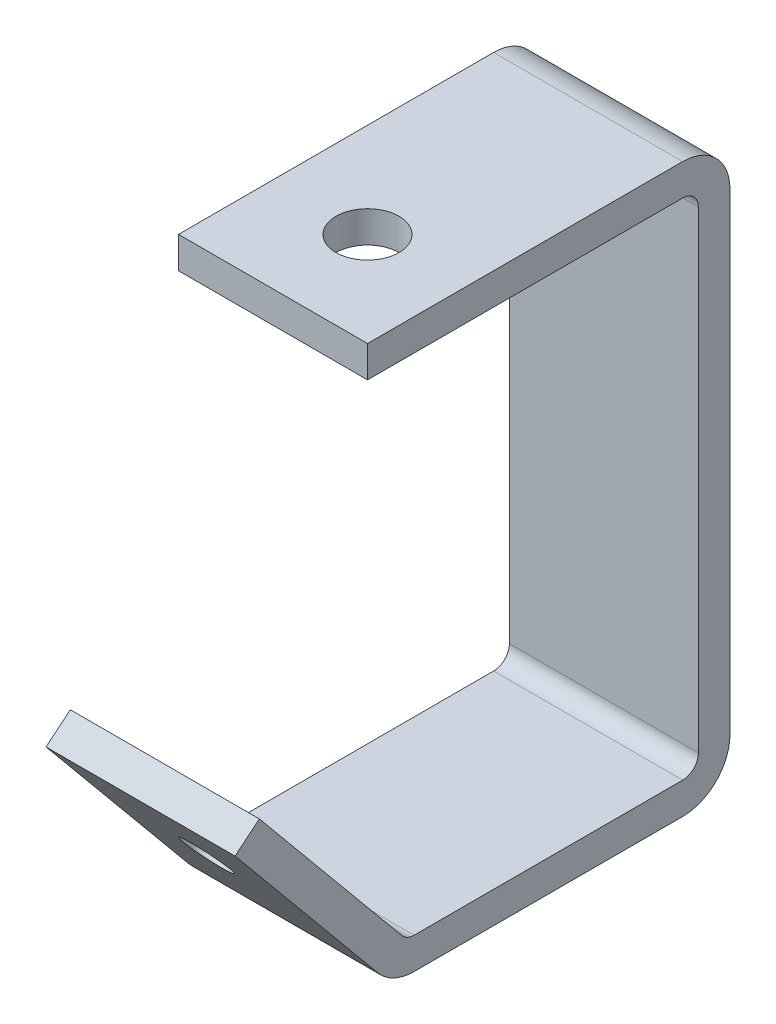
ISO-10303-21;
HEADER;
FILE_DESCRIPTION(('STEP AP214'),'2;1');
FILE_NAME('part.step','',(''),(''),'','','');
FILE_SCHEMA(('AUTOMOTIVE_DESIGN { 1 0 10303 214 1 1 1 1 }'));
ENDSEC;
DATA;
#1=APPLICATION_CONTEXT('core data for automotive mechanical design processes');
#2=APPLICATION_PROTOCOL_DEFINITION('international standard','automotive_design',2000,#1);
#3=PRODUCT_CONTEXT('',#1,'mechanical');
#4=PRODUCT('Part','Part','',(#3));
#5=PRODUCT_RELATED_PRODUCT_CATEGORY('part','',(#4));
#6=PRODUCT_DEFINITION_FORMATION('','',#4);
#7=PRODUCT_DEFINITION_CONTEXT('part definition',#1,'design');
#8=PRODUCT_DEFINITION('design','',#6,#7);
#9=PRODUCT_DEFINITION_SHAPE('','',#8);
#10=(LENGTH_UNIT() NAMED_UNIT(*) SI_UNIT(.MILLI.,.METRE.));
#11=(NAMED_UNIT(*) PLANE_ANGLE_UNIT() SI_UNIT($,.RADIAN.));
#12=(NAMED_UNIT(*) SI_UNIT($,.STERADIAN.) SOLID_ANGLE_UNIT());
#13=UNCERTAINTY_MEASURE_WITH_UNIT(LENGTH_MEASURE(1.E-05),#10,'distance_accuracy_value','');
#14=(GEOMETRIC_REPRESENTATION_CONTEXT(3) GLOBAL_UNCERTAINTY_ASSIGNED_CONTEXT((#13)) GLOBAL_UNIT_ASSIGNED_CONTEXT((#10,
#11,#12)) REPRESENTATION_CONTEXT('',''));
#15=CARTESIAN_POINT('',(0.,0.,0.));
#16=DIRECTION('',(0.,0.,1.));
#17=DIRECTION('',(1.,0.,0.));
#18=AXIS2_PLACEMENT_3D('',#15,#16,#17);
#19=CARTESIAN_POINT('',(38.1,0.,0.));
#20=DIRECTION('',(0.,0.,-1.));
#21=DIRECTION('',(-1.,0.,0.));
#22=AXIS2_PLACEMENT_3D('',#19,#20,#21);
#23=PLANE('',#22);
#24=DIRECTION('',(0.,-1.,0.));
#25=VECTOR('',#24,1.);
#26=CARTESIAN_POINT('',(0.,0.,0.));
#27=LINE('',#26,#25);
#28=CARTESIAN_POINT('',(0.,0.,0.));
#29=VERTEX_POINT('',#28);
#30=CARTESIAN_POINT('',(0.,-6.35,0.));
#31=VERTEX_POINT('',#30);
#32=EDGE_CURVE('E194',#29,#31,#27,.T.);
#33=ORIENTED_EDGE('',*,*,#32,.T.);
#34=DIRECTION('',(-1.,0.,0.));
#35=VECTOR('',#34,1.);
#36=CARTESIAN_POINT('',(38.1,-6.35,0.));
#37=LINE('',#36,#35);
#38=CARTESIAN_POINT('',(38.1,-6.35,0.));
#39=VERTEX_POINT('',#38);
#40=EDGE_CURVE('E11',#39,#31,#37,.T.);
#41=ORIENTED_EDGE('',*,*,#40,.F.);
#42=DIRECTION('',(0.,-1.,0.));
#43=VECTOR('',#42,1.);
#44=CARTESIAN_POINT('',(38.1,0.,0.));
#45=LINE('',#44,#43);
#46=CARTESIAN_POINT('',(38.1,0.,0.));
#47=VERTEX_POINT('',#46);
#48=EDGE_CURVE('E241',#47,#39,#45,.T.);
#49=ORIENTED_EDGE('',*,*,#48,.F.);
#50=DIRECTION('',(-1.,0.,0.));
#51=VECTOR('',#50,1.);
#52=CARTESIAN_POINT('',(38.1,0.,0.));
#53=LINE('',#52,#51);
#54=EDGE_CURVE('E190',#47,#29,#53,.T.);
#55=ORIENTED_EDGE('',*,*,#54,.T.);
#56=EDGE_LOOP('',(#33,#41,#49,#55));
#57=FACE_BOUND('',#56,.T.);
#58=ADVANCED_FACE('F45',(#57),#23,.F.);
#59=CARTESIAN_POINT('',(38.1,-6.35,0.));
#60=DIRECTION('',(0.,1.,0.));
#61=DIRECTION('',(0.,0.,1.));
#62=AXIS2_PLACEMENT_3D('',#59,#60,#61);
#63=PLANE('',#62);
#64=CARTESIAN_POINT('',(19.05,-6.34999999999999,-19.04));
#65=DIRECTION('',(0.,1.,0.));
#66=DIRECTION('',(0.,0.,1.));
#67=AXIS2_PLACEMENT_3D('',#64,#65,#66);
#68=CIRCLE('',#67,6.35);
#69=CARTESIAN_POINT('',(19.05,-6.34999999999999,-12.69));
#70=VERTEX_POINT('',#69);
#71=EDGE_CURVE('E199',#70,#70,#68,.F.);
#72=ORIENTED_EDGE('',*,*,#71,.F.);
#73=EDGE_LOOP('',(#72));
#74=FACE_BOUND('',#73,.T.);
#75=DIRECTION('',(0.,0.,-1.));
#76=VECTOR('',#75,1.);
#77=CARTESIAN_POINT('',(0.,-6.35,0.));
#78=LINE('',#77,#76);
#79=CARTESIAN_POINT('',(0.,-6.35,-63.51));
#80=VERTEX_POINT('',#79);
#81=EDGE_CURVE('E198',#31,#80,#78,.T.);
#82=ORIENTED_EDGE('',*,*,#81,.T.);
#83=DIRECTION('',(-1.,0.,0.));
#84=VECTOR('',#83,1.);
#85=CARTESIAN_POINT('',(38.1,-6.35,-63.51));
#86=LINE('',#85,#84);
#87=CARTESIAN_POINT('',(38.1,-6.35,-63.51));
#88=VERTEX_POINT('',#87);
#89=EDGE_CURVE('E54',#88,#80,#86,.T.);
#90=ORIENTED_EDGE('',*,*,#89,.F.);
#91=DIRECTION('',(0.,0.,-1.));
#92=VECTOR('',#91,1.);
#93=CARTESIAN_POINT('',(38.1,-6.35,0.));
#94=LINE('',#93,#92);
#95=EDGE_CURVE('E129',#39,#88,#94,.T.);
#96=ORIENTED_EDGE('',*,*,#95,.F.);
#97=ORIENTED_EDGE('',*,*,#40,.T.);
#98=EDGE_LOOP('',(#82,#90,#96,#97));
#99=FACE_BOUND('',#98,.T.);
#100=ADVANCED_FACE('F367',(#74,#99),#63,.F.);
#101=CARTESIAN_POINT('',(38.1,-9.53,-63.51));
#102=DIRECTION('',(-1.,0.,0.));
#103=DIRECTION('',(0.,0.,1.));
#104=AXIS2_PLACEMENT_3D('',#101,#102,#103);
#105=CYLINDRICAL_SURFACE('',#104,3.18);
#106=CARTESIAN_POINT('',(0.,-9.53,-63.51));
#107=DIRECTION('',(-1.,0.,0.));
#108=DIRECTION('',(0.,0.,1.));
#109=AXIS2_PLACEMENT_3D('',#106,#107,#108);
#110=CIRCLE('',#109,3.18);
#111=CARTESIAN_POINT('',(0.,-9.53,-66.69));
#112=VERTEX_POINT('',#111);
#113=EDGE_CURVE('E202',#80,#112,#110,.T.);
#114=ORIENTED_EDGE('',*,*,#113,.T.);
#115=DIRECTION('',(-1.,0.,0.));
#116=VECTOR('',#115,1.);
#117=CARTESIAN_POINT('',(38.1,-9.53,-66.69));
#118=LINE('',#117,#116);
#119=CARTESIAN_POINT('',(38.1,-9.53,-66.69));
#120=VERTEX_POINT('',#119);
#121=EDGE_CURVE('E284',#120,#112,#118,.T.);
#122=ORIENTED_EDGE('',*,*,#121,.F.);
#123=CARTESIAN_POINT('',(38.1,-9.53,-63.51));
#124=DIRECTION('',(-1.,0.,0.));
#125=DIRECTION('',(0.,0.,1.));
#126=AXIS2_PLACEMENT_3D('',#123,#124,#125);
#127=CIRCLE('',#126,3.18);
#128=EDGE_CURVE('E294',#88,#120,#127,.T.);
#129=ORIENTED_EDGE('',*,*,#128,.F.);
#130=ORIENTED_EDGE('',*,*,#89,.T.);
#131=EDGE_LOOP('',(#114,#122,#129,#130));
#132=FACE_BOUND('',#131,.T.);
#133=ADVANCED_FACE('F292',(#132),#105,.F.);
#134=CARTESIAN_POINT('',(38.1,-9.53,-66.69));
#135=DIRECTION('',(0.,0.,-1.));
#136=DIRECTION('',(0.,1.,0.));
#137=AXIS2_PLACEMENT_3D('',#134,#135,#136);
#138=PLANE('',#137);
#139=DIRECTION('',(0.,-1.,0.));
#140=VECTOR('',#139,1.);
#141=CARTESIAN_POINT('',(0.,-9.53,-66.69));
#142=LINE('',#141,#140);
#143=CARTESIAN_POINT('',(0.,-104.78,-66.69));
#144=VERTEX_POINT('',#143);
#145=EDGE_CURVE('E205',#112,#144,#142,.T.);
#146=ORIENTED_EDGE('',*,*,#145,.T.);
#147=DIRECTION('',(-1.,0.,0.));
#148=VECTOR('',#147,1.);
#149=CARTESIAN_POINT('',(38.1,-104.78,-66.69));
#150=LINE('',#149,#148);
#151=CARTESIAN_POINT('',(38.1,-104.78,-66.69));
#152=VERTEX_POINT('',#151);
#153=EDGE_CURVE('E280',#152,#144,#150,.T.);
#154=ORIENTED_EDGE('',*,*,#153,.F.);
#155=DIRECTION('',(0.,-1.,0.));
#156=VECTOR('',#155,1.);
#157=CARTESIAN_POINT('',(38.1,-9.53,-66.69));
#158=LINE('',#157,#156);
#159=EDGE_CURVE('E313',#120,#152,#158,.T.);
#160=ORIENTED_EDGE('',*,*,#159,.F.);
#161=ORIENTED_EDGE('',*,*,#121,.T.);
#162=EDGE_LOOP('',(#146,#154,#160,#161));
#163=FACE_BOUND('',#162,.T.);
#164=ADVANCED_FACE('F303',(#163),#138,.F.);
#165=CARTESIAN_POINT('',(38.1,-104.78,-63.51));
#166=DIRECTION('',(-1.,0.,0.));
#167=DIRECTION('',(0.,0.,1.));
#168=AXIS2_PLACEMENT_3D('',#165,#166,#167);
#169=CYLINDRICAL_SURFACE('',#168,3.18000000000001);
#170=CARTESIAN_POINT('',(0.,-104.78,-63.51));
#171=DIRECTION('',(-1.,0.,0.));
#172=DIRECTION('',(0.,0.,1.));
#173=AXIS2_PLACEMENT_3D('',#170,#171,#172);
#174=CIRCLE('',#173,3.18000000000001);
#175=CARTESIAN_POINT('',(0.,-107.96,-63.51));
#176=VERTEX_POINT('',#175);
#177=EDGE_CURVE('E208',#144,#176,#174,.T.);
#178=ORIENTED_EDGE('',*,*,#177,.T.);
#179=DIRECTION('',(-1.,0.,0.));
#180=VECTOR('',#179,1.);
#181=CARTESIAN_POINT('',(38.1,-107.96,-63.51));
#182=LINE('',#181,#180);
#183=CARTESIAN_POINT('',(38.1,-107.96,-63.51));
#184=VERTEX_POINT('',#183);
#185=EDGE_CURVE('E276',#184,#176,#182,.T.);
#186=ORIENTED_EDGE('',*,*,#185,.F.);
#187=CARTESIAN_POINT('',(38.1,-104.78,-63.51));
#188=DIRECTION('',(-1.,0.,0.));
#189=DIRECTION('',(0.,0.,1.));
#190=AXIS2_PLACEMENT_3D('',#187,#188,#189);
#191=CIRCLE('',#190,3.18000000000001);
#192=EDGE_CURVE('E309',#152,#184,#191,.T.);
#193=ORIENTED_EDGE('',*,*,#192,.F.);
#194=ORIENTED_EDGE('',*,*,#153,.T.);
#195=EDGE_LOOP('',(#178,#186,#193,#194));
#196=FACE_BOUND('',#195,.T.);
#197=ADVANCED_FACE('F307',(#196),#169,.F.);
#198=CARTESIAN_POINT('',(38.1,-107.96,-63.51));
#199=DIRECTION('',(0.,-1.,0.));
#200=DIRECTION('',(0.,0.,-1.));
#201=AXIS2_PLACEMENT_3D('',#198,#199,#200);
#202=PLANE('',#201);
#203=DIRECTION('',(0.,0.,1.));
#204=VECTOR('',#203,1.);
#205=CARTESIAN_POINT('',(0.,-107.96,-63.51));
#206=LINE('',#205,#204);
#207=CARTESIAN_POINT('',(0.,-107.96,-9.39000000000001));
#208=VERTEX_POINT('',#207);
#209=EDGE_CURVE('E211',#176,#208,#206,.T.);
#210=ORIENTED_EDGE('',*,*,#209,.T.);
#211=DIRECTION('',(-1.,0.,0.));
#212=VECTOR('',#211,1.);
#213=CARTESIAN_POINT('',(38.1,-107.96,-9.39000000000001));
#214=LINE('',#213,#212);
#215=CARTESIAN_POINT('',(38.1,-107.96,-9.39000000000001));
#216=VERTEX_POINT('',#215);
#217=EDGE_CURVE('E272',#216,#208,#214,.T.);
#218=ORIENTED_EDGE('',*,*,#217,.F.);
#219=DIRECTION('',(0.,0.,1.));
#220=VECTOR('',#219,1.);
#221=CARTESIAN_POINT('',(38.1,-107.96,-63.51));
#222=LINE('',#221,#220);
#223=EDGE_CURVE('E312',#184,#216,#222,.T.);
#224=ORIENTED_EDGE('',*,*,#223,.F.);
#225=ORIENTED_EDGE('',*,*,#185,.T.);
#226=EDGE_LOOP('',(#210,#218,#224,#225));
#227=FACE_BOUND('',#226,.T.);
#228=ADVANCED_FACE('F382',(#227),#202,.F.);
#229=CARTESIAN_POINT('',(38.1,-104.78,-9.39000000000001));
#230=DIRECTION('',(-1.,0.,0.));
#231=DIRECTION('',(0.,0.,1.));
#232=AXIS2_PLACEMENT_3D('',#229,#230,#231);
#233=CYLINDRICAL_SURFACE('',#232,3.18);
#234=CARTESIAN_POINT('',(0.,-104.78,-9.39000000000001));
#235=DIRECTION('',(-1.,0.,0.));
#236=DIRECTION('',(0.,0.,1.));
#237=AXIS2_PLACEMENT_3D('',#234,#235,#236);
#238=CIRCLE('',#237,3.18);
#239=CARTESIAN_POINT('',(0.,-106.807009423942,-6.93976882820203));
#240=VERTEX_POINT('',#239);
#241=EDGE_CURVE('E214',#208,#240,#238,.T.);
#242=ORIENTED_EDGE('',*,*,#241,.T.);
#243=DIRECTION('',(-1.,0.,0.));
#244=VECTOR('',#243,1.);
#245=CARTESIAN_POINT('',(38.1,-106.807009423942,-6.93976882820203));
#246=LINE('',#245,#244);
#247=CARTESIAN_POINT('',(38.1,-106.807009423942,-6.93976882820203));
#248=VERTEX_POINT('',#247);
#249=EDGE_CURVE('E268',#248,#240,#246,.T.);
#250=ORIENTED_EDGE('',*,*,#249,.F.);
#251=CARTESIAN_POINT('',(38.1,-104.78,-9.39000000000001));
#252=DIRECTION('',(-1.,0.,0.));
#253=DIRECTION('',(0.,0.,1.));
#254=AXIS2_PLACEMENT_3D('',#251,#252,#253);
#255=CIRCLE('',#254,3.18);
#256=EDGE_CURVE('E317',#216,#248,#255,.T.);
#257=ORIENTED_EDGE('',*,*,#256,.F.);
#258=ORIENTED_EDGE('',*,*,#217,.T.);
#259=EDGE_LOOP('',(#242,#250,#257,#258));
#260=FACE_BOUND('',#259,.T.);
#261=ADVANCED_FACE('F385',(#260),#233,.F.);
#262=CARTESIAN_POINT('',(38.1,-106.807009423942,-6.93976882820203));
#263=DIRECTION('',(0.,-0.637424347151558,0.770512947106283));
#264=DIRECTION('',(0.,-0.770512947106283,-0.637424347151558));
#265=AXIS2_PLACEMENT_3D('',#262,#263,#264);
#266=PLANE('',#265);
#267=CARTESIAN_POINT('',(19.05,-88.0989550682014,8.53689432063778));
#268=DIRECTION('',(0.,-0.637424347151558,0.770512947106283));
#269=DIRECTION('',(0.,-0.770512947106283,-0.637424347151558));
#270=AXIS2_PLACEMENT_3D('',#267,#268,#269);
#271=CIRCLE('',#270,4.765);
#272=CARTESIAN_POINT('',(19.05,-91.7704492611628,5.49956730646061));
#273=VERTEX_POINT('',#272);
#274=EDGE_CURVE('E538',#273,#273,#271,.F.);
#275=ORIENTED_EDGE('',*,*,#274,.F.);
#276=EDGE_LOOP('',(#275));
#277=FACE_BOUND('',#276,.T.);
#278=DIRECTION('',(0.,0.770512947106283,0.637424347151558));
#279=VECTOR('',#278,1.);
#280=CARTESIAN_POINT('',(0.,-106.807009423942,-6.93976882820203));
#281=LINE('',#280,#279);
#282=CARTESIAN_POINT('',(0.,-72.0645806389196,21.8016949848617));
#283=VERTEX_POINT('',#282);
#284=EDGE_CURVE('E217',#240,#283,#281,.T.);
#285=ORIENTED_EDGE('',*,*,#284,.T.);
#286=DIRECTION('',(-1.,0.,0.));
#287=VECTOR('',#286,1.);
#288=CARTESIAN_POINT('',(38.1,-72.0645806389196,21.8016949848617));
#289=LINE('',#288,#287);
#290=CARTESIAN_POINT('',(38.1,-72.0645806389196,21.8016949848617));
#291=VERTEX_POINT('',#290);
#292=EDGE_CURVE('E264',#291,#283,#289,.T.);
#293=ORIENTED_EDGE('',*,*,#292,.F.);
#294=DIRECTION('',(0.,0.770512947106283,0.637424347151558));
#295=VECTOR('',#294,1.);
#296=CARTESIAN_POINT('',(38.1,-106.807009423942,-6.93976882820203));
#297=LINE('',#296,#295);
#298=EDGE_CURVE('E324',#248,#291,#297,.T.);
#299=ORIENTED_EDGE('',*,*,#298,.F.);
#300=ORIENTED_EDGE('',*,*,#249,.T.);
#301=EDGE_LOOP('',(#285,#293,#299,#300));
#302=FACE_BOUND('',#301,.T.);
#303=ADVANCED_FACE('F389',(#277,#302),#266,.F.);
#304=CARTESIAN_POINT('',(38.1,-76.112225243332,26.6944521989866));
#305=DIRECTION('',(0.,-0.770512947106282,-0.637424347151559));
#306=DIRECTION('',(0.,0.637424347151559,-0.770512947106282));
#307=AXIS2_PLACEMENT_3D('',#304,#305,#306);
#308=PLANE('',#307);
#309=DIRECTION('',(0.,-0.637424347151559,0.770512947106283));
#310=VECTOR('',#309,1.);
#311=CARTESIAN_POINT('',(0.,-76.112225243332,26.6944521989866));
#312=LINE('',#311,#310);
#313=CARTESIAN_POINT('',(0.,-76.112225243332,26.6944521989866));
#314=VERTEX_POINT('',#313);
#315=EDGE_CURVE('E220',#283,#314,#312,.T.);
#316=ORIENTED_EDGE('',*,*,#315,.T.);
#317=DIRECTION('',(-1.,0.,0.));
#318=VECTOR('',#317,1.);
#319=CARTESIAN_POINT('',(38.1,-76.112225243332,26.6944521989866));
#320=LINE('',#319,#318);
#321=CARTESIAN_POINT('',(38.1,-76.112225243332,26.6944521989866));
#322=VERTEX_POINT('',#321);
#323=EDGE_CURVE('E260',#322,#314,#320,.T.);
#324=ORIENTED_EDGE('',*,*,#323,.F.);
#325=DIRECTION('',(0.,-0.637424347151559,0.770512947106283));
#326=VECTOR('',#325,1.);
#327=CARTESIAN_POINT('',(38.1,-76.112225243332,26.6944521989866));
#328=LINE('',#327,#326);
#329=EDGE_CURVE('E327',#291,#322,#328,.T.);
#330=ORIENTED_EDGE('',*,*,#329,.F.);
#331=ORIENTED_EDGE('',*,*,#292,.T.);
#332=EDGE_LOOP('',(#316,#324,#330,#331));
#333=FACE_BOUND('',#332,.T.);
#334=ADVANCED_FACE('F393',(#333),#308,.F.);
#335=CARTESIAN_POINT('',(38.1,-110.854654028354,-2.04701161407714));
#336=DIRECTION('',(0.,0.637424347151558,-0.770512947106283));
#337=DIRECTION('',(0.,0.770512947106283,0.637424347151558));
#338=AXIS2_PLACEMENT_3D('',#335,#336,#337);
#339=PLANE('',#338);
#340=CARTESIAN_POINT('',(19.05,-92.1465996726138,13.4296515347627));
#341=DIRECTION('',(0.,-0.637424347151558,0.770512947106283));
#342=DIRECTION('',(0.,-0.770512947106283,-0.637424347151558));
#343=AXIS2_PLACEMENT_3D('',#340,#341,#342);
#344=CIRCLE('',#343,4.765);
#345=CARTESIAN_POINT('',(19.05,-95.8180938655752,10.3923245205855));
#346=VERTEX_POINT('',#345);
#347=EDGE_CURVE('E535',#346,#346,#344,.T.);
#348=ORIENTED_EDGE('',*,*,#347,.F.);
#349=EDGE_LOOP('',(#348));
#350=FACE_BOUND('',#349,.T.);
#351=DIRECTION('',(0.,-0.770512947106283,-0.637424347151558));
#352=VECTOR('',#351,1.);
#353=CARTESIAN_POINT('',(0.,-110.854654028354,-2.04701161407714));
#354=LINE('',#353,#352);
#355=CARTESIAN_POINT('',(0.,-110.854654028354,-2.04701161407715));
#356=VERTEX_POINT('',#355);
#357=EDGE_CURVE('E223',#314,#356,#354,.T.);
#358=ORIENTED_EDGE('',*,*,#357,.T.);
#359=DIRECTION('',(-1.,0.,0.));
#360=VECTOR('',#359,1.);
#361=CARTESIAN_POINT('',(38.1,-110.854654028354,-2.04701161407715));
#362=LINE('',#361,#360);
#363=CARTESIAN_POINT('',(38.1,-110.854654028354,-2.04701161407715));
#364=VERTEX_POINT('',#363);
#365=EDGE_CURVE('E256',#364,#356,#362,.T.);
#366=ORIENTED_EDGE('',*,*,#365,.F.);
#367=DIRECTION('',(0.,-0.770512947106283,-0.637424347151558));
#368=VECTOR('',#367,1.);
#369=CARTESIAN_POINT('',(38.1,-110.854654028354,-2.04701161407714));
#370=LINE('',#369,#368);
#371=EDGE_CURVE('E330',#322,#364,#370,.T.);
#372=ORIENTED_EDGE('',*,*,#371,.F.);
#373=ORIENTED_EDGE('',*,*,#323,.T.);
#374=EDGE_LOOP('',(#358,#366,#372,#373));
#375=FACE_BOUND('',#374,.T.);
#376=ADVANCED_FACE('F397',(#350,#375),#339,.F.);
#377=CARTESIAN_POINT('',(38.1,-104.78,-9.39000000000001));
#378=DIRECTION('',(-1.,0.,0.));
#379=DIRECTION('',(0.,0.,1.));
#380=AXIS2_PLACEMENT_3D('',#377,#378,#379);
#381=CYLINDRICAL_SURFACE('',#380,9.52999999999998);
#382=CARTESIAN_POINT('',(0.,-104.78,-9.39000000000001));
#383=DIRECTION('',(1.,0.,0.));
#384=DIRECTION('',(0.,0.,1.));
#385=AXIS2_PLACEMENT_3D('',#382,#383,#384);
#386=CIRCLE('',#385,9.52999999999998);
#387=CARTESIAN_POINT('',(0.,-114.31,-9.39000000000001));
#388=VERTEX_POINT('',#387);
#389=EDGE_CURVE('E226',#356,#388,#386,.T.);
#390=ORIENTED_EDGE('',*,*,#389,.T.);
#391=DIRECTION('',(-1.,0.,0.));
#392=VECTOR('',#391,1.);
#393=CARTESIAN_POINT('',(38.1,-114.31,-9.39000000000001));
#394=LINE('',#393,#392);
#395=CARTESIAN_POINT('',(38.1,-114.31,-9.39000000000001));
#396=VERTEX_POINT('',#395);
#397=EDGE_CURVE('E252',#396,#388,#394,.T.);
#398=ORIENTED_EDGE('',*,*,#397,.F.);
#399=CARTESIAN_POINT('',(38.1,-104.78,-9.39000000000001));
#400=DIRECTION('',(1.,0.,0.));
#401=DIRECTION('',(0.,0.,1.));
#402=AXIS2_PLACEMENT_3D('',#399,#400,#401);
#403=CIRCLE('',#402,9.52999999999998);
#404=EDGE_CURVE('E333',#364,#396,#403,.T.);
#405=ORIENTED_EDGE('',*,*,#404,.F.);
#406=ORIENTED_EDGE('',*,*,#365,.T.);
#407=EDGE_LOOP('',(#390,#398,#405,#406));
#408=FACE_BOUND('',#407,.T.);
#409=ADVANCED_FACE('F401',(#408),#381,.T.);
#410=CARTESIAN_POINT('',(38.1,-114.31,-63.51));
#411=DIRECTION('',(0.,1.,0.));
#412=DIRECTION('',(0.,0.,1.));
#413=AXIS2_PLACEMENT_3D('',#410,#411,#412);
#414=PLANE('',#413);
#415=DIRECTION('',(0.,0.,-1.));
#416=VECTOR('',#415,1.);
#417=CARTESIAN_POINT('',(0.,-114.31,-63.51));
#418=LINE('',#417,#416);
#419=CARTESIAN_POINT('',(0.,-114.31,-63.51));
#420=VERTEX_POINT('',#419);
#421=EDGE_CURVE('E229',#388,#420,#418,.T.);
#422=ORIENTED_EDGE('',*,*,#421,.T.);
#423=DIRECTION('',(-1.,0.,0.));
#424=VECTOR('',#423,1.);
#425=CARTESIAN_POINT('',(38.1,-114.31,-63.51));
#426=LINE('',#425,#424);
#427=CARTESIAN_POINT('',(38.1,-114.31,-63.51));
#428=VERTEX_POINT('',#427);
#429=EDGE_CURVE('E248',#428,#420,#426,.T.);
#430=ORIENTED_EDGE('',*,*,#429,.F.);
#431=DIRECTION('',(0.,0.,-1.));
#432=VECTOR('',#431,1.);
#433=CARTESIAN_POINT('',(38.1,-114.31,-63.51));
#434=LINE('',#433,#432);
#435=EDGE_CURVE('E336',#396,#428,#434,.T.);
#436=ORIENTED_EDGE('',*,*,#435,.F.);
#437=ORIENTED_EDGE('',*,*,#397,.T.);
#438=EDGE_LOOP('',(#422,#430,#436,#437));
#439=FACE_BOUND('',#438,.T.);
#440=ADVANCED_FACE('F344',(#439),#414,.F.);
#441=CARTESIAN_POINT('',(38.1,-104.78,-63.51));
#442=DIRECTION('',(-1.,0.,0.));
#443=DIRECTION('',(0.,0.,1.));
#444=AXIS2_PLACEMENT_3D('',#441,#442,#443);
#445=CYLINDRICAL_SURFACE('',#444,9.53);
#446=CARTESIAN_POINT('',(0.,-104.78,-63.51));
#447=DIRECTION('',(1.,0.,0.));
#448=DIRECTION('',(0.,0.,1.));
#449=AXIS2_PLACEMENT_3D('',#446,#447,#448);
#450=CIRCLE('',#449,9.53);
#451=CARTESIAN_POINT('',(0.,-104.78,-73.04));
#452=VERTEX_POINT('',#451);
#453=EDGE_CURVE('E232',#420,#452,#450,.T.);
#454=ORIENTED_EDGE('',*,*,#453,.T.);
#455=DIRECTION('',(-1.,0.,0.));
#456=VECTOR('',#455,1.);
#457=CARTESIAN_POINT('',(38.1,-104.78,-73.04));
#458=LINE('',#457,#456);
#459=CARTESIAN_POINT('',(38.1,-104.78,-73.04));
#460=VERTEX_POINT('',#459);
#461=EDGE_CURVE('E183',#460,#452,#458,.T.);
#462=ORIENTED_EDGE('',*,*,#461,.F.);
#463=CARTESIAN_POINT('',(38.1,-104.78,-63.51));
#464=DIRECTION('',(1.,0.,0.));
#465=DIRECTION('',(0.,0.,1.));
#466=AXIS2_PLACEMENT_3D('',#463,#464,#465);
#467=CIRCLE('',#466,9.53);
#468=EDGE_CURVE('E172',#428,#460,#467,.T.);
#469=ORIENTED_EDGE('',*,*,#468,.F.);
#470=ORIENTED_EDGE('',*,*,#429,.T.);
#471=EDGE_LOOP('',(#454,#462,#469,#470));
#472=FACE_BOUND('',#471,.T.);
#473=ADVANCED_FACE('F348',(#472),#445,.T.);
#474=CARTESIAN_POINT('',(38.1,-9.53,-73.04));
#475=DIRECTION('',(0.,0.,1.));
#476=DIRECTION('',(1.,0.,0.));
#477=AXIS2_PLACEMENT_3D('',#474,#475,#476);
#478=PLANE('',#477);
#479=DIRECTION('',(0.,1.,0.));
#480=VECTOR('',#479,1.);
#481=CARTESIAN_POINT('',(0.,-9.53,-73.04));
#482=LINE('',#481,#480);
#483=CARTESIAN_POINT('',(0.,-9.53,-73.04));
#484=VERTEX_POINT('',#483);
#485=EDGE_CURVE('E181',#452,#484,#482,.T.);
#486=ORIENTED_EDGE('',*,*,#485,.T.);
#487=DIRECTION('',(-1.,0.,0.));
#488=VECTOR('',#487,1.);
#489=CARTESIAN_POINT('',(38.1,-9.53,-73.04));
#490=LINE('',#489,#488);
#491=CARTESIAN_POINT('',(38.1,-9.53,-73.04));
#492=VERTEX_POINT('',#491);
#493=EDGE_CURVE('E178',#492,#484,#490,.T.);
#494=ORIENTED_EDGE('',*,*,#493,.F.);
#495=DIRECTION('',(0.,1.,0.));
#496=VECTOR('',#495,1.);
#497=CARTESIAN_POINT('',(38.1,-9.53,-73.04));
#498=LINE('',#497,#496);
#499=EDGE_CURVE('E166',#460,#492,#498,.T.);
#500=ORIENTED_EDGE('',*,*,#499,.F.);
#501=ORIENTED_EDGE('',*,*,#461,.T.);
#502=EDGE_LOOP('',(#486,#494,#500,#501));
#503=FACE_BOUND('',#502,.T.);
#504=ADVANCED_FACE('F179',(#503),#478,.F.);
#505=CARTESIAN_POINT('',(38.1,-9.53,-63.51));
#506=DIRECTION('',(-1.,0.,0.));
#507=DIRECTION('',(0.,0.,1.));
#508=AXIS2_PLACEMENT_3D('',#505,#506,#507);
#509=CYLINDRICAL_SURFACE('',#508,9.53);
#510=CARTESIAN_POINT('',(0.,-9.53,-63.51));
#511=DIRECTION('',(1.,0.,0.));
#512=DIRECTION('',(0.,0.,1.));
#513=AXIS2_PLACEMENT_3D('',#510,#511,#512);
#514=CIRCLE('',#513,9.53);
#515=CARTESIAN_POINT('',(0.,0.,-63.51));
#516=VERTEX_POINT('',#515);
#517=EDGE_CURVE('E115',#484,#516,#514,.T.);
#518=ORIENTED_EDGE('',*,*,#517,.T.);
#519=DIRECTION('',(-1.,0.,0.));
#520=VECTOR('',#519,1.);
#521=CARTESIAN_POINT('',(38.1,0.,-63.51));
#522=LINE('',#521,#520);
#523=CARTESIAN_POINT('',(38.1,0.,-63.51));
#524=VERTEX_POINT('',#523);
#525=EDGE_CURVE('E184',#524,#516,#522,.T.);
#526=ORIENTED_EDGE('',*,*,#525,.F.);
#527=CARTESIAN_POINT('',(38.1,-9.53,-63.51));
#528=DIRECTION('',(1.,0.,0.));
#529=DIRECTION('',(0.,0.,1.));
#530=AXIS2_PLACEMENT_3D('',#527,#528,#529);
#531=CIRCLE('',#530,9.53);
#532=EDGE_CURVE('E170',#492,#524,#531,.T.);
#533=ORIENTED_EDGE('',*,*,#532,.F.);
#534=ORIENTED_EDGE('',*,*,#493,.T.);
#535=EDGE_LOOP('',(#518,#526,#533,#534));
#536=FACE_BOUND('',#535,.T.);
#537=ADVANCED_FACE('F186',(#536),#509,.T.);
#538=CARTESIAN_POINT('',(38.1,0.,0.));
#539=DIRECTION('',(0.,-1.,0.));
#540=DIRECTION('',(0.,0.,-1.));
#541=AXIS2_PLACEMENT_3D('',#538,#539,#540);
#542=PLANE('',#541);
#543=CARTESIAN_POINT('',(19.05,0.,-19.04));
#544=DIRECTION('',(0.,1.,0.));
#545=DIRECTION('',(0.,0.,1.));
#546=AXIS2_PLACEMENT_3D('',#543,#544,#545);
#547=CIRCLE('',#546,6.35);
#548=CARTESIAN_POINT('',(19.05,0.,-12.69));
#549=VERTEX_POINT('',#548);
#550=EDGE_CURVE('E540',#549,#549,#547,.T.);
#551=ORIENTED_EDGE('',*,*,#550,.F.);
#552=EDGE_LOOP('',(#551));
#553=FACE_BOUND('',#552,.T.);
#554=DIRECTION('',(0.,0.,1.));
#555=VECTOR('',#554,1.);
#556=CARTESIAN_POINT('',(0.,0.,0.));
#557=LINE('',#556,#555);
#558=EDGE_CURVE('E121',#516,#29,#557,.T.);
#559=ORIENTED_EDGE('',*,*,#558,.T.);
#560=ORIENTED_EDGE('',*,*,#54,.F.);
#561=DIRECTION('',(0.,0.,1.));
#562=VECTOR('',#561,1.);
#563=CARTESIAN_POINT('',(38.1,0.,0.));
#564=LINE('',#563,#562);
#565=EDGE_CURVE('E62',#524,#47,#564,.T.);
#566=ORIENTED_EDGE('',*,*,#565,.F.);
#567=ORIENTED_EDGE('',*,*,#525,.T.);
#568=EDGE_LOOP('',(#559,#560,#566,#567));
#569=FACE_BOUND('',#568,.T.);
#570=ADVANCED_FACE('F352',(#553,#569),#542,.F.);
#571=CARTESIAN_POINT('',(38.1,-9.53,-63.51));
#572=DIRECTION('',(-1.,0.,0.));
#573=DIRECTION('',(0.,0.,1.));
#574=AXIS2_PLACEMENT_3D('',#571,#572,#573);
#575=PLANE('',#574);
#576=ORIENTED_EDGE('',*,*,#48,.T.);
#577=ORIENTED_EDGE('',*,*,#95,.T.);
#578=ORIENTED_EDGE('',*,*,#128,.T.);
#579=ORIENTED_EDGE('',*,*,#159,.T.);
#580=ORIENTED_EDGE('',*,*,#192,.T.);
#581=ORIENTED_EDGE('',*,*,#223,.T.);
#582=ORIENTED_EDGE('',*,*,#256,.T.);
#583=ORIENTED_EDGE('',*,*,#298,.T.);
#584=ORIENTED_EDGE('',*,*,#329,.T.);
#585=ORIENTED_EDGE('',*,*,#371,.T.);
#586=ORIENTED_EDGE('',*,*,#404,.T.);
#587=ORIENTED_EDGE('',*,*,#435,.T.);
#588=ORIENTED_EDGE('',*,*,#468,.T.);
#589=ORIENTED_EDGE('',*,*,#499,.T.);
#590=ORIENTED_EDGE('',*,*,#532,.T.);
#591=ORIENTED_EDGE('',*,*,#565,.T.);
#592=EDGE_LOOP('',(#576,#577,#578,#579,#580,#581,#582,#583,#584,#585,#586,#587,#588,#589,#590,#591));
#593=FACE_BOUND('',#592,.T.);
#594=ADVANCED_FACE('F168',(#593),#575,.F.);
#595=CARTESIAN_POINT('',(0.,-9.53,-63.51));
#596=DIRECTION('',(-1.,0.,0.));
#597=DIRECTION('',(0.,0.,1.));
#598=AXIS2_PLACEMENT_3D('',#595,#596,#597);
#599=PLANE('',#598);
#600=ORIENTED_EDGE('',*,*,#32,.F.);
#601=ORIENTED_EDGE('',*,*,#558,.F.);
#602=ORIENTED_EDGE('',*,*,#517,.F.);
#603=ORIENTED_EDGE('',*,*,#485,.F.);
#604=ORIENTED_EDGE('',*,*,#453,.F.);
#605=ORIENTED_EDGE('',*,*,#421,.F.);
#606=ORIENTED_EDGE('',*,*,#389,.F.);
#607=ORIENTED_EDGE('',*,*,#357,.F.);
#608=ORIENTED_EDGE('',*,*,#315,.F.);
#609=ORIENTED_EDGE('',*,*,#284,.F.);
#610=ORIENTED_EDGE('',*,*,#241,.F.);
#611=ORIENTED_EDGE('',*,*,#209,.F.);
#612=ORIENTED_EDGE('',*,*,#177,.F.);
#613=ORIENTED_EDGE('',*,*,#145,.F.);
#614=ORIENTED_EDGE('',*,*,#113,.F.);
#615=ORIENTED_EDGE('',*,*,#81,.F.);
#616=EDGE_LOOP('',(#600,#601,#602,#603,#604,#605,#606,#607,#608,#609,#610,#611,#612,#613,#614,#615));
#617=FACE_BOUND('',#616,.T.);
#618=ADVANCED_FACE('F298',(#617),#599,.T.);
#619=CARTESIAN_POINT('',(19.05,-114.311,-19.04));
#620=DIRECTION('',(0.,1.,0.));
#621=DIRECTION('',(0.,0.,1.));
#622=AXIS2_PLACEMENT_3D('',#619,#620,#621);
#623=CYLINDRICAL_SURFACE('',#622,6.35);
#624=ORIENTED_EDGE('',*,*,#550,.T.);
#625=EDGE_LOOP('',(#624));
#626=FACE_BOUND('',#625,.T.);
#627=ORIENTED_EDGE('',*,*,#71,.T.);
#628=EDGE_LOOP('',(#627));
#629=FACE_BOUND('',#628,.T.);
#630=ADVANCED_FACE('F430',(#626,#629),#623,.F.);
#631=CARTESIAN_POINT('',(19.05,-12.2366102338284,-83.1648411934399));
#632=DIRECTION('',(0.,-0.637424347151558,0.770512947106283));
#633=DIRECTION('',(0.,-0.770512947106283,-0.637424347151558));
#634=AXIS2_PLACEMENT_3D('',#631,#632,#633);
#635=CYLINDRICAL_SURFACE('',#634,4.765);
#636=ORIENTED_EDGE('',*,*,#347,.T.);
#637=EDGE_LOOP('',(#636));
#638=FACE_BOUND('',#637,.T.);
#639=ORIENTED_EDGE('',*,*,#274,.T.);
#640=EDGE_LOOP('',(#639));
#641=FACE_BOUND('',#640,.T.);
#642=ADVANCED_FACE('F440',(#638,#641),#635,.F.);
#643=CLOSED_SHELL('',(#58,#100,#133,#164,#197,#228,#261,#303,#334,#376,#409,#440,#473,#504,#537,
#570,#594,#618,#630,#642));
#644=MANIFOLD_SOLID_BREP('B2',#643);
#645=ADVANCED_BREP_SHAPE_REPRESENTATION('',(#18,#644),#14);
#646=SHAPE_DEFINITION_REPRESENTATION(#9,#645);
ENDSEC;
END-ISO-10303-21;
